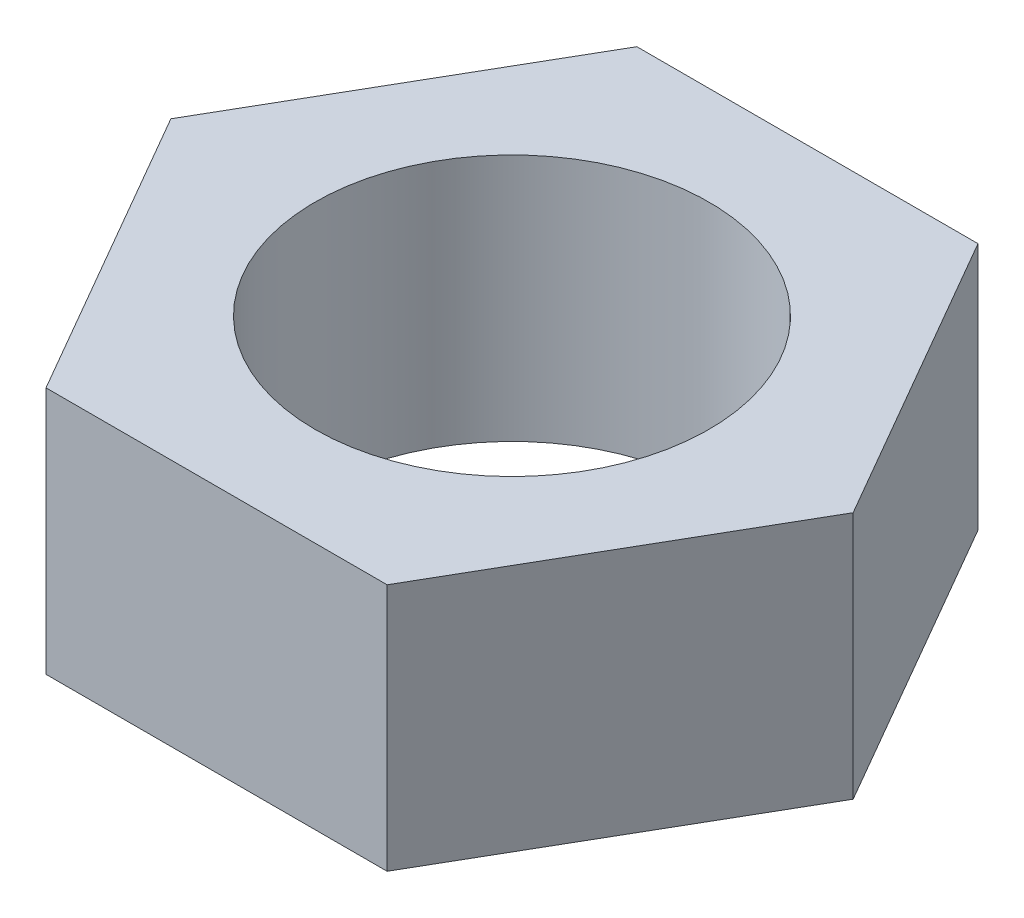
ISO-10303-21;
HEADER;
FILE_DESCRIPTION(('STEP AP214'),'2;1');
FILE_NAME('part.step','',(''),(''),'','','');
FILE_SCHEMA(('AUTOMOTIVE_DESIGN { 1 0 10303 214 1 1 1 1 }'));
ENDSEC;
DATA;
#1=APPLICATION_CONTEXT('core data for automotive mechanical design processes');
#2=APPLICATION_PROTOCOL_DEFINITION('international standard','automotive_design',2000,#1);
#3=PRODUCT_CONTEXT('',#1,'mechanical');
#4=PRODUCT('Part','Part','',(#3));
#5=PRODUCT_RELATED_PRODUCT_CATEGORY('part','',(#4));
#6=PRODUCT_DEFINITION_FORMATION('','',#4);
#7=PRODUCT_DEFINITION_CONTEXT('part definition',#1,'design');
#8=PRODUCT_DEFINITION('design','',#6,#7);
#9=PRODUCT_DEFINITION_SHAPE('','',#8);
#10=(LENGTH_UNIT() NAMED_UNIT(*) SI_UNIT(.MILLI.,.METRE.));
#11=(NAMED_UNIT(*) PLANE_ANGLE_UNIT() SI_UNIT($,.RADIAN.));
#12=(NAMED_UNIT(*) SI_UNIT($,.STERADIAN.) SOLID_ANGLE_UNIT());
#13=UNCERTAINTY_MEASURE_WITH_UNIT(LENGTH_MEASURE(1.E-05),#10,'distance_accuracy_value','');
#14=(GEOMETRIC_REPRESENTATION_CONTEXT(3) GLOBAL_UNCERTAINTY_ASSIGNED_CONTEXT((#13)) GLOBAL_UNIT_ASSIGNED_CONTEXT((#10,
#11,#12)) REPRESENTATION_CONTEXT('',''));
#15=CARTESIAN_POINT('',(0.,0.,0.));
#16=DIRECTION('',(0.,0.,1.));
#17=DIRECTION('',(1.,0.,0.));
#18=AXIS2_PLACEMENT_3D('',#15,#16,#17);
#19=CARTESIAN_POINT('',(0.,2.,0.));
#20=DIRECTION('',(0.,1.,0.));
#21=DIRECTION('',(0.,0.,1.));
#22=AXIS2_PLACEMENT_3D('',#19,#20,#21);
#23=PLANE('',#22);
#24=DIRECTION('',(0.5,0.,-0.866025403784439));
#25=VECTOR('',#24,1.);
#26=CARTESIAN_POINT('',(1.3748153285078,2.,2.38125));
#27=LINE('',#26,#25);
#28=CARTESIAN_POINT('',(1.3748153285078,2.,2.38125));
#29=VERTEX_POINT('',#28);
#30=CARTESIAN_POINT('',(2.74963065701559,2.,0.));
#31=VERTEX_POINT('',#30);
#32=EDGE_CURVE('E129',#29,#31,#27,.T.);
#33=ORIENTED_EDGE('',*,*,#32,.T.);
#34=DIRECTION('',(-0.5,0.,-0.866025403784438));
#35=VECTOR('',#34,1.);
#36=CARTESIAN_POINT('',(2.74963065701559,2.,0.));
#37=LINE('',#36,#35);
#38=CARTESIAN_POINT('',(1.37481532850779,2.,-2.38125));
#39=VERTEX_POINT('',#38);
#40=EDGE_CURVE('E87',#31,#39,#37,.T.);
#41=ORIENTED_EDGE('',*,*,#40,.T.);
#42=DIRECTION('',(-1.,0.,0.));
#43=VECTOR('',#42,1.);
#44=CARTESIAN_POINT('',(1.37481532850779,2.,-2.38125));
#45=LINE('',#44,#43);
#46=CARTESIAN_POINT('',(-1.3748153285078,2.,-2.38125));
#47=VERTEX_POINT('',#46);
#48=EDGE_CURVE('E100',#39,#47,#45,.T.);
#49=ORIENTED_EDGE('',*,*,#48,.T.);
#50=DIRECTION('',(-0.5,0.,0.866025403784439));
#51=VECTOR('',#50,1.);
#52=CARTESIAN_POINT('',(-1.3748153285078,2.,-2.38125));
#53=LINE('',#52,#51);
#54=CARTESIAN_POINT('',(-2.74963065701559,2.,0.));
#55=VERTEX_POINT('',#54);
#56=EDGE_CURVE('E94',#47,#55,#53,.T.);
#57=ORIENTED_EDGE('',*,*,#56,.T.);
#58=DIRECTION('',(0.5,0.,0.866025403784439));
#59=VECTOR('',#58,1.);
#60=CARTESIAN_POINT('',(-2.74963065701559,2.,0.));
#61=LINE('',#60,#59);
#62=CARTESIAN_POINT('',(-1.3748153285078,2.,2.38125));
#63=VERTEX_POINT('',#62);
#64=EDGE_CURVE('E98',#55,#63,#61,.T.);
#65=ORIENTED_EDGE('',*,*,#64,.T.);
#66=DIRECTION('',(1.,0.,0.));
#67=VECTOR('',#66,1.);
#68=CARTESIAN_POINT('',(-1.3748153285078,2.,2.38125));
#69=LINE('',#68,#67);
#70=EDGE_CURVE('E50',#63,#29,#69,.T.);
#71=ORIENTED_EDGE('',*,*,#70,.T.);
#72=EDGE_LOOP('',(#33,#41,#49,#57,#65,#71));
#73=FACE_BOUND('',#72,.T.);
#74=CARTESIAN_POINT('',(0.,2.,0.));
#75=DIRECTION('',(0.,1.,0.));
#76=DIRECTION('',(0.,0.,1.));
#77=AXIS2_PLACEMENT_3D('',#74,#75,#76);
#78=CIRCLE('',#77,1.5875);
#79=CARTESIAN_POINT('',(0.,2.,1.5875));
#80=VERTEX_POINT('',#79);
#81=EDGE_CURVE('E122',#80,#80,#78,.T.);
#82=ORIENTED_EDGE('',*,*,#81,.F.);
#83=EDGE_LOOP('',(#82));
#84=FACE_BOUND('',#83,.T.);
#85=ADVANCED_FACE('F33',(#73,#84),#23,.T.);
#86=CARTESIAN_POINT('',(0.,0.,0.));
#87=DIRECTION('',(0.,1.,0.));
#88=DIRECTION('',(0.,0.,1.));
#89=AXIS2_PLACEMENT_3D('',#86,#87,#88);
#90=PLANE('',#89);
#91=DIRECTION('',(0.5,0.,-0.866025403784439));
#92=VECTOR('',#91,1.);
#93=CARTESIAN_POINT('',(1.3748153285078,0.,2.38125));
#94=LINE('',#93,#92);
#95=CARTESIAN_POINT('',(1.3748153285078,0.,2.38125));
#96=VERTEX_POINT('',#95);
#97=CARTESIAN_POINT('',(2.74963065701559,0.,0.));
#98=VERTEX_POINT('',#97);
#99=EDGE_CURVE('E118',#96,#98,#94,.T.);
#100=ORIENTED_EDGE('',*,*,#99,.F.);
#101=DIRECTION('',(1.,0.,0.));
#102=VECTOR('',#101,1.);
#103=CARTESIAN_POINT('',(-1.3748153285078,0.,2.38125));
#104=LINE('',#103,#102);
#105=CARTESIAN_POINT('',(-1.3748153285078,0.,2.38125));
#106=VERTEX_POINT('',#105);
#107=EDGE_CURVE('E79',#106,#96,#104,.T.);
#108=ORIENTED_EDGE('',*,*,#107,.F.);
#109=DIRECTION('',(0.5,0.,0.866025403784439));
#110=VECTOR('',#109,1.);
#111=CARTESIAN_POINT('',(-2.74963065701559,0.,0.));
#112=LINE('',#111,#110);
#113=CARTESIAN_POINT('',(-2.74963065701559,0.,0.));
#114=VERTEX_POINT('',#113);
#115=EDGE_CURVE('E73',#114,#106,#112,.T.);
#116=ORIENTED_EDGE('',*,*,#115,.F.);
#117=DIRECTION('',(-0.5,0.,0.866025403784439));
#118=VECTOR('',#117,1.);
#119=CARTESIAN_POINT('',(-1.3748153285078,0.,-2.38125));
#120=LINE('',#119,#118);
#121=CARTESIAN_POINT('',(-1.3748153285078,0.,-2.38125));
#122=VERTEX_POINT('',#121);
#123=EDGE_CURVE('E108',#122,#114,#120,.T.);
#124=ORIENTED_EDGE('',*,*,#123,.F.);
#125=DIRECTION('',(-1.,0.,0.));
#126=VECTOR('',#125,1.);
#127=CARTESIAN_POINT('',(1.37481532850779,0.,-2.38125));
#128=LINE('',#127,#126);
#129=CARTESIAN_POINT('',(1.37481532850779,0.,-2.38125));
#130=VERTEX_POINT('',#129);
#131=EDGE_CURVE('E124',#130,#122,#128,.T.);
#132=ORIENTED_EDGE('',*,*,#131,.F.);
#133=DIRECTION('',(-0.5,0.,-0.866025403784438));
#134=VECTOR('',#133,1.);
#135=CARTESIAN_POINT('',(2.74963065701559,0.,0.));
#136=LINE('',#135,#134);
#137=EDGE_CURVE('E121',#98,#130,#136,.T.);
#138=ORIENTED_EDGE('',*,*,#137,.F.);
#139=EDGE_LOOP('',(#100,#108,#116,#124,#132,#138));
#140=FACE_BOUND('',#139,.T.);
#141=CARTESIAN_POINT('',(0.,0.,0.));
#142=DIRECTION('',(0.,1.,0.));
#143=DIRECTION('',(0.,0.,1.));
#144=AXIS2_PLACEMENT_3D('',#141,#142,#143);
#145=CIRCLE('',#144,1.5875);
#146=CARTESIAN_POINT('',(0.,0.,1.5875));
#147=VERTEX_POINT('',#146);
#148=EDGE_CURVE('E222',#147,#147,#145,.T.);
#149=ORIENTED_EDGE('',*,*,#148,.T.);
#150=EDGE_LOOP('',(#149));
#151=FACE_BOUND('',#150,.T.);
#152=ADVANCED_FACE('F138',(#140,#151),#90,.F.);
#153=CARTESIAN_POINT('',(1.3748153285078,2.,2.38125));
#154=DIRECTION('',(-0.866025403784439,0.,-0.5));
#155=DIRECTION('',(-0.5,0.,0.866025403784439));
#156=AXIS2_PLACEMENT_3D('',#153,#154,#155);
#157=PLANE('',#156);
#158=ORIENTED_EDGE('',*,*,#99,.T.);
#159=DIRECTION('',(0.,-1.,0.));
#160=VECTOR('',#159,1.);
#161=CARTESIAN_POINT('',(2.74963065701559,2.,0.));
#162=LINE('',#161,#160);
#163=EDGE_CURVE('E11',#31,#98,#162,.T.);
#164=ORIENTED_EDGE('',*,*,#163,.F.);
#165=ORIENTED_EDGE('',*,*,#32,.F.);
#166=DIRECTION('',(0.,-1.,0.));
#167=VECTOR('',#166,1.);
#168=CARTESIAN_POINT('',(1.3748153285078,2.,2.38125));
#169=LINE('',#168,#167);
#170=EDGE_CURVE('E114',#29,#96,#169,.T.);
#171=ORIENTED_EDGE('',*,*,#170,.T.);
#172=EDGE_LOOP('',(#158,#164,#165,#171));
#173=FACE_BOUND('',#172,.T.);
#174=ADVANCED_FACE('F35',(#173),#157,.F.);
#175=CARTESIAN_POINT('',(2.74963065701559,2.,0.));
#176=DIRECTION('',(-0.866025403784438,0.,0.5));
#177=DIRECTION('',(0.5,0.,0.866025403784439));
#178=AXIS2_PLACEMENT_3D('',#175,#176,#177);
#179=PLANE('',#178);
#180=ORIENTED_EDGE('',*,*,#137,.T.);
#181=DIRECTION('',(0.,-1.,0.));
#182=VECTOR('',#181,1.);
#183=CARTESIAN_POINT('',(1.37481532850779,2.,-2.38125));
#184=LINE('',#183,#182);
#185=EDGE_CURVE('E42',#39,#130,#184,.T.);
#186=ORIENTED_EDGE('',*,*,#185,.F.);
#187=ORIENTED_EDGE('',*,*,#40,.F.);
#188=ORIENTED_EDGE('',*,*,#163,.T.);
#189=EDGE_LOOP('',(#180,#186,#187,#188));
#190=FACE_BOUND('',#189,.T.);
#191=ADVANCED_FACE('F163',(#190),#179,.F.);
#192=CARTESIAN_POINT('',(1.37481532850779,2.,-2.38125));
#193=DIRECTION('',(0.,0.,1.));
#194=DIRECTION('',(1.,0.,0.));
#195=AXIS2_PLACEMENT_3D('',#192,#193,#194);
#196=PLANE('',#195);
#197=ORIENTED_EDGE('',*,*,#131,.T.);
#198=DIRECTION('',(0.,-1.,0.));
#199=VECTOR('',#198,1.);
#200=CARTESIAN_POINT('',(-1.3748153285078,2.,-2.38125));
#201=LINE('',#200,#199);
#202=EDGE_CURVE('E109',#47,#122,#201,.T.);
#203=ORIENTED_EDGE('',*,*,#202,.F.);
#204=ORIENTED_EDGE('',*,*,#48,.F.);
#205=ORIENTED_EDGE('',*,*,#185,.T.);
#206=EDGE_LOOP('',(#197,#203,#204,#205));
#207=FACE_BOUND('',#206,.T.);
#208=ADVANCED_FACE('F135',(#207),#196,.F.);
#209=CARTESIAN_POINT('',(-1.3748153285078,2.,-2.38125));
#210=DIRECTION('',(0.866025403784439,0.,0.5));
#211=DIRECTION('',(0.5,0.,-0.866025403784439));
#212=AXIS2_PLACEMENT_3D('',#209,#210,#211);
#213=PLANE('',#212);
#214=ORIENTED_EDGE('',*,*,#123,.T.);
#215=DIRECTION('',(0.,-1.,0.));
#216=VECTOR('',#215,1.);
#217=CARTESIAN_POINT('',(-2.74963065701559,2.,0.));
#218=LINE('',#217,#216);
#219=EDGE_CURVE('E105',#55,#114,#218,.T.);
#220=ORIENTED_EDGE('',*,*,#219,.F.);
#221=ORIENTED_EDGE('',*,*,#56,.F.);
#222=ORIENTED_EDGE('',*,*,#202,.T.);
#223=EDGE_LOOP('',(#214,#220,#221,#222));
#224=FACE_BOUND('',#223,.T.);
#225=ADVANCED_FACE('F106',(#224),#213,.F.);
#226=CARTESIAN_POINT('',(-2.74963065701559,2.,0.));
#227=DIRECTION('',(0.866025403784439,0.,-0.5));
#228=DIRECTION('',(-0.5,0.,-0.866025403784439));
#229=AXIS2_PLACEMENT_3D('',#226,#227,#228);
#230=PLANE('',#229);
#231=ORIENTED_EDGE('',*,*,#115,.T.);
#232=DIRECTION('',(0.,-1.,0.));
#233=VECTOR('',#232,1.);
#234=CARTESIAN_POINT('',(-1.3748153285078,2.,2.38125));
#235=LINE('',#234,#233);
#236=EDGE_CURVE('E110',#63,#106,#235,.T.);
#237=ORIENTED_EDGE('',*,*,#236,.F.);
#238=ORIENTED_EDGE('',*,*,#64,.F.);
#239=ORIENTED_EDGE('',*,*,#219,.T.);
#240=EDGE_LOOP('',(#231,#237,#238,#239));
#241=FACE_BOUND('',#240,.T.);
#242=ADVANCED_FACE('F112',(#241),#230,.F.);
#243=CARTESIAN_POINT('',(-1.3748153285078,2.,2.38125));
#244=DIRECTION('',(0.,0.,-1.));
#245=DIRECTION('',(-1.,0.,0.));
#246=AXIS2_PLACEMENT_3D('',#243,#244,#245);
#247=PLANE('',#246);
#248=ORIENTED_EDGE('',*,*,#107,.T.);
#249=ORIENTED_EDGE('',*,*,#170,.F.);
#250=ORIENTED_EDGE('',*,*,#70,.F.);
#251=ORIENTED_EDGE('',*,*,#236,.T.);
#252=EDGE_LOOP('',(#248,#249,#250,#251));
#253=FACE_BOUND('',#252,.T.);
#254=ADVANCED_FACE('F143',(#253),#247,.F.);
#255=CARTESIAN_POINT('',(0.,2.,0.));
#256=DIRECTION('',(0.,-1.,0.));
#257=DIRECTION('',(0.,0.,-1.));
#258=AXIS2_PLACEMENT_3D('',#255,#256,#257);
#259=CYLINDRICAL_SURFACE('',#258,1.5875);
#260=ORIENTED_EDGE('',*,*,#81,.T.);
#261=EDGE_LOOP('',(#260));
#262=FACE_BOUND('',#261,.T.);
#263=ORIENTED_EDGE('',*,*,#148,.F.);
#264=EDGE_LOOP('',(#263));
#265=FACE_BOUND('',#264,.T.);
#266=ADVANCED_FACE('F145',(#262,#265),#259,.F.);
#267=CLOSED_SHELL('',(#85,#152,#174,#191,#208,#225,#242,#254,#266));
#268=MANIFOLD_SOLID_BREP('B2',#267);
#269=ADVANCED_BREP_SHAPE_REPRESENTATION('',(#18,#268),#14);
#270=SHAPE_DEFINITION_REPRESENTATION(#9,#269);
ENDSEC;
END-ISO-10303-21;
